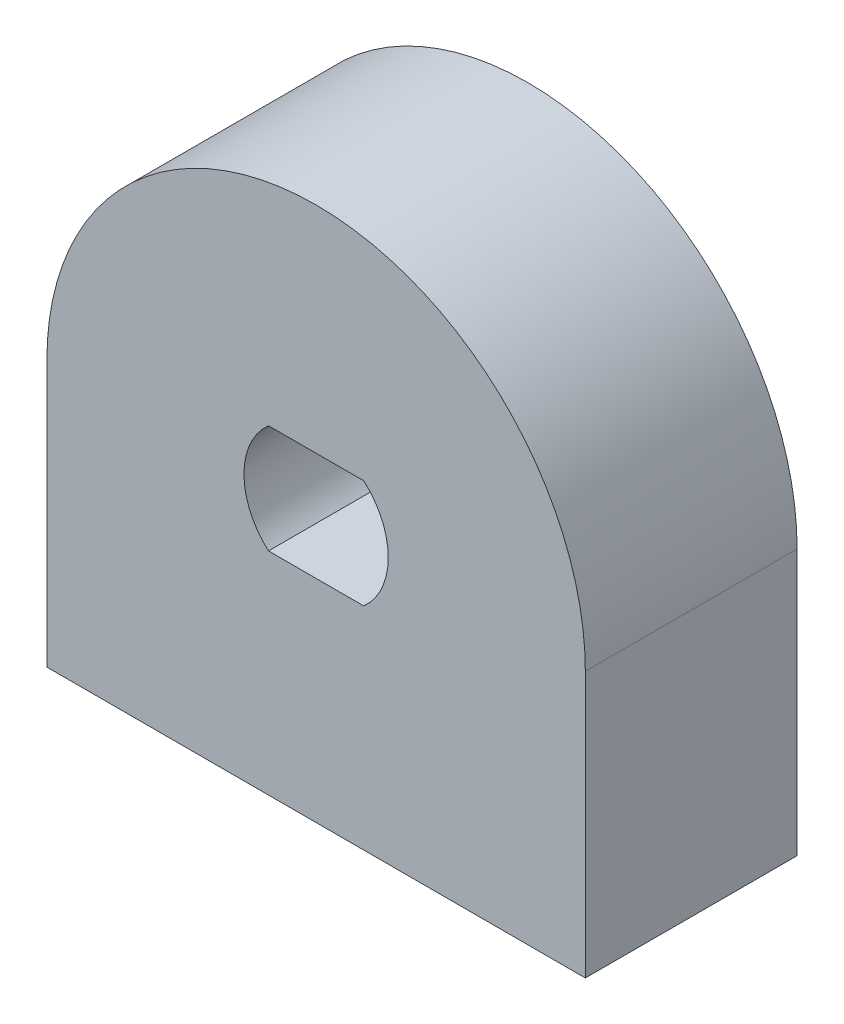
ISO-10303-21;
HEADER;
FILE_DESCRIPTION(('STEP AP214'),'2;1');
FILE_NAME('part.step','',(''),(''),'','','');
FILE_SCHEMA(('AUTOMOTIVE_DESIGN { 1 0 10303 214 1 1 1 1 }'));
ENDSEC;
DATA;
#1=APPLICATION_CONTEXT('core data for automotive mechanical design processes');
#2=APPLICATION_PROTOCOL_DEFINITION('international standard','automotive_design',2000,#1);
#3=PRODUCT_CONTEXT('',#1,'mechanical');
#4=PRODUCT('Part','Part','',(#3));
#5=PRODUCT_RELATED_PRODUCT_CATEGORY('part','',(#4));
#6=PRODUCT_DEFINITION_FORMATION('','',#4);
#7=PRODUCT_DEFINITION_CONTEXT('part definition',#1,'design');
#8=PRODUCT_DEFINITION('design','',#6,#7);
#9=PRODUCT_DEFINITION_SHAPE('','',#8);
#10=(LENGTH_UNIT() NAMED_UNIT(*) SI_UNIT(.MILLI.,.METRE.));
#11=(NAMED_UNIT(*) PLANE_ANGLE_UNIT() SI_UNIT($,.RADIAN.));
#12=(NAMED_UNIT(*) SI_UNIT($,.STERADIAN.) SOLID_ANGLE_UNIT());
#13=UNCERTAINTY_MEASURE_WITH_UNIT(LENGTH_MEASURE(1.E-05),#10,'distance_accuracy_value','');
#14=(GEOMETRIC_REPRESENTATION_CONTEXT(3) GLOBAL_UNCERTAINTY_ASSIGNED_CONTEXT((#13)) GLOBAL_UNIT_ASSIGNED_CONTEXT((#10,
#11,#12)) REPRESENTATION_CONTEXT('',''));
#15=CARTESIAN_POINT('',(0.,0.,0.));
#16=DIRECTION('',(0.,0.,1.));
#17=DIRECTION('',(1.,0.,0.));
#18=AXIS2_PLACEMENT_3D('',#15,#16,#17);
#19=CARTESIAN_POINT('',(7.5,7.4,5.9));
#20=DIRECTION('',(0.,0.,-1.));
#21=DIRECTION('',(-1.,0.,0.));
#22=AXIS2_PLACEMENT_3D('',#19,#20,#21);
#23=PLANE('',#22);
#24=DIRECTION('',(0.,-1.,0.));
#25=VECTOR('',#24,1.);
#26=CARTESIAN_POINT('',(0.,0.,5.9));
#27=LINE('',#26,#25);
#28=CARTESIAN_POINT('',(0.,7.4,5.9));
#29=VERTEX_POINT('',#28);
#30=CARTESIAN_POINT('',(0.,0.,5.9));
#31=VERTEX_POINT('',#30);
#32=EDGE_CURVE('E131',#29,#31,#27,.T.);
#33=ORIENTED_EDGE('',*,*,#32,.T.);
#34=DIRECTION('',(1.,0.,0.));
#35=VECTOR('',#34,1.);
#36=CARTESIAN_POINT('',(0.,0.,5.9));
#37=LINE('',#36,#35);
#38=CARTESIAN_POINT('',(15.,0.,5.9));
#39=VERTEX_POINT('',#38);
#40=EDGE_CURVE('E134',#31,#39,#37,.T.);
#41=ORIENTED_EDGE('',*,*,#40,.T.);
#42=DIRECTION('',(0.,1.,0.));
#43=VECTOR('',#42,1.);
#44=CARTESIAN_POINT('',(15.,0.,5.9));
#45=LINE('',#44,#43);
#46=CARTESIAN_POINT('',(15.,7.4,5.9));
#47=VERTEX_POINT('',#46);
#48=EDGE_CURVE('E137',#39,#47,#45,.T.);
#49=ORIENTED_EDGE('',*,*,#48,.T.);
#50=CARTESIAN_POINT('',(7.5,7.4,5.9));
#51=DIRECTION('',(0.,0.,1.));
#52=DIRECTION('',(-1.,0.,0.));
#53=AXIS2_PLACEMENT_3D('',#50,#51,#52);
#54=CIRCLE('',#53,7.5);
#55=EDGE_CURVE('E139',#47,#29,#54,.T.);
#56=ORIENTED_EDGE('',*,*,#55,.T.);
#57=EDGE_LOOP('',(#33,#41,#49,#56));
#58=FACE_BOUND('',#57,.T.);
#59=CARTESIAN_POINT('',(7.5,7.4,5.9));
#60=DIRECTION('',(0.,0.,1.));
#61=DIRECTION('',(1.,0.,0.));
#62=AXIS2_PLACEMENT_3D('',#59,#60,#61);
#63=CIRCLE('',#62,2.01);
#64=CARTESIAN_POINT('',(6.17335008385784,8.91,5.9));
#65=VERTEX_POINT('',#64);
#66=CARTESIAN_POINT('',(6.17335008385784,5.89,5.9));
#67=VERTEX_POINT('',#66);
#68=EDGE_CURVE('E95',#65,#67,#63,.T.);
#69=ORIENTED_EDGE('',*,*,#68,.F.);
#70=DIRECTION('',(-1.,0.,0.));
#71=VECTOR('',#70,1.);
#72=CARTESIAN_POINT('',(6.17335008385784,8.91,5.9));
#73=LINE('',#72,#71);
#74=CARTESIAN_POINT('',(8.82664991614216,8.91,5.9));
#75=VERTEX_POINT('',#74);
#76=EDGE_CURVE('E117',#75,#65,#73,.T.);
#77=ORIENTED_EDGE('',*,*,#76,.F.);
#78=CARTESIAN_POINT('',(7.5,7.4,5.9));
#79=DIRECTION('',(0.,0.,1.));
#80=DIRECTION('',(1.,0.,0.));
#81=AXIS2_PLACEMENT_3D('',#78,#79,#80);
#82=CIRCLE('',#81,2.01);
#83=CARTESIAN_POINT('',(8.82664991614216,5.89,5.9));
#84=VERTEX_POINT('',#83);
#85=EDGE_CURVE('E115',#84,#75,#82,.T.);
#86=ORIENTED_EDGE('',*,*,#85,.F.);
#87=DIRECTION('',(1.,0.,0.));
#88=VECTOR('',#87,1.);
#89=CARTESIAN_POINT('',(6.17335008385784,5.89,5.9));
#90=LINE('',#89,#88);
#91=EDGE_CURVE('E103',#67,#84,#90,.T.);
#92=ORIENTED_EDGE('',*,*,#91,.F.);
#93=EDGE_LOOP('',(#69,#77,#86,#92));
#94=FACE_BOUND('',#93,.T.);
#95=ADVANCED_FACE('F30',(#58,#94),#23,.F.);
#96=CARTESIAN_POINT('',(7.5,7.4,0.));
#97=DIRECTION('',(0.,0.,-1.));
#98=DIRECTION('',(-1.,0.,0.));
#99=AXIS2_PLACEMENT_3D('',#96,#97,#98);
#100=PLANE('',#99);
#101=DIRECTION('',(0.,-1.,0.));
#102=VECTOR('',#101,1.);
#103=CARTESIAN_POINT('',(0.,0.,0.));
#104=LINE('',#103,#102);
#105=CARTESIAN_POINT('',(0.,7.4,0.));
#106=VERTEX_POINT('',#105);
#107=CARTESIAN_POINT('',(0.,0.,0.));
#108=VERTEX_POINT('',#107);
#109=EDGE_CURVE('E111',#106,#108,#104,.T.);
#110=ORIENTED_EDGE('',*,*,#109,.F.);
#111=CARTESIAN_POINT('',(7.5,7.4,0.));
#112=DIRECTION('',(0.,0.,1.));
#113=DIRECTION('',(-1.,0.,0.));
#114=AXIS2_PLACEMENT_3D('',#111,#112,#113);
#115=CIRCLE('',#114,7.5);
#116=CARTESIAN_POINT('',(15.,7.4,0.));
#117=VERTEX_POINT('',#116);
#118=EDGE_CURVE('E135',#117,#106,#115,.T.);
#119=ORIENTED_EDGE('',*,*,#118,.F.);
#120=DIRECTION('',(0.,1.,0.));
#121=VECTOR('',#120,1.);
#122=CARTESIAN_POINT('',(15.,0.,0.));
#123=LINE('',#122,#121);
#124=CARTESIAN_POINT('',(15.,0.,0.));
#125=VERTEX_POINT('',#124);
#126=EDGE_CURVE('E146',#125,#117,#123,.T.);
#127=ORIENTED_EDGE('',*,*,#126,.F.);
#128=DIRECTION('',(1.,0.,0.));
#129=VECTOR('',#128,1.);
#130=CARTESIAN_POINT('',(0.,0.,0.));
#131=LINE('',#130,#129);
#132=EDGE_CURVE('E144',#108,#125,#131,.T.);
#133=ORIENTED_EDGE('',*,*,#132,.F.);
#134=EDGE_LOOP('',(#110,#119,#127,#133));
#135=FACE_BOUND('',#134,.T.);
#136=DIRECTION('',(-1.,0.,0.));
#137=VECTOR('',#136,1.);
#138=CARTESIAN_POINT('',(6.17335008385784,8.91,0.));
#139=LINE('',#138,#137);
#140=CARTESIAN_POINT('',(8.82664991614216,8.91,0.));
#141=VERTEX_POINT('',#140);
#142=CARTESIAN_POINT('',(6.17335008385784,8.91,0.));
#143=VERTEX_POINT('',#142);
#144=EDGE_CURVE('E104',#141,#143,#139,.T.);
#145=ORIENTED_EDGE('',*,*,#144,.T.);
#146=CARTESIAN_POINT('',(7.5,7.4,0.));
#147=DIRECTION('',(0.,0.,1.));
#148=DIRECTION('',(1.,0.,0.));
#149=AXIS2_PLACEMENT_3D('',#146,#147,#148);
#150=CIRCLE('',#149,2.01);
#151=CARTESIAN_POINT('',(6.17335008385784,5.89,0.));
#152=VERTEX_POINT('',#151);
#153=EDGE_CURVE('E53',#143,#152,#150,.T.);
#154=ORIENTED_EDGE('',*,*,#153,.T.);
#155=DIRECTION('',(1.,0.,0.));
#156=VECTOR('',#155,1.);
#157=CARTESIAN_POINT('',(6.17335008385784,5.89,0.));
#158=LINE('',#157,#156);
#159=CARTESIAN_POINT('',(8.82664991614216,5.89,0.));
#160=VERTEX_POINT('',#159);
#161=EDGE_CURVE('E110',#152,#160,#158,.T.);
#162=ORIENTED_EDGE('',*,*,#161,.T.);
#163=CARTESIAN_POINT('',(7.5,7.4,0.));
#164=DIRECTION('',(0.,0.,1.));
#165=DIRECTION('',(1.,0.,0.));
#166=AXIS2_PLACEMENT_3D('',#163,#164,#165);
#167=CIRCLE('',#166,2.01);
#168=EDGE_CURVE('E123',#160,#141,#167,.T.);
#169=ORIENTED_EDGE('',*,*,#168,.T.);
#170=EDGE_LOOP('',(#145,#154,#162,#169));
#171=FACE_BOUND('',#170,.T.);
#172=ADVANCED_FACE('F164',(#135,#171),#100,.T.);
#173=CARTESIAN_POINT('',(0.,0.,5.9));
#174=DIRECTION('',(1.,0.,0.));
#175=DIRECTION('',(0.,0.,-1.));
#176=AXIS2_PLACEMENT_3D('',#173,#174,#175);
#177=PLANE('',#176);
#178=ORIENTED_EDGE('',*,*,#109,.T.);
#179=DIRECTION('',(0.,0.,-1.));
#180=VECTOR('',#179,1.);
#181=CARTESIAN_POINT('',(0.,0.,5.9));
#182=LINE('',#181,#180);
#183=EDGE_CURVE('E11',#31,#108,#182,.T.);
#184=ORIENTED_EDGE('',*,*,#183,.F.);
#185=ORIENTED_EDGE('',*,*,#32,.F.);
#186=DIRECTION('',(0.,0.,-1.));
#187=VECTOR('',#186,1.);
#188=CARTESIAN_POINT('',(0.,7.4,5.9));
#189=LINE('',#188,#187);
#190=EDGE_CURVE('E141',#29,#106,#189,.T.);
#191=ORIENTED_EDGE('',*,*,#190,.T.);
#192=EDGE_LOOP('',(#178,#184,#185,#191));
#193=FACE_BOUND('',#192,.T.);
#194=ADVANCED_FACE('F32',(#193),#177,.F.);
#195=CARTESIAN_POINT('',(0.,0.,5.9));
#196=DIRECTION('',(0.,1.,0.));
#197=DIRECTION('',(-1.,0.,0.));
#198=AXIS2_PLACEMENT_3D('',#195,#196,#197);
#199=PLANE('',#198);
#200=ORIENTED_EDGE('',*,*,#132,.T.);
#201=DIRECTION('',(0.,0.,-1.));
#202=VECTOR('',#201,1.);
#203=CARTESIAN_POINT('',(15.,0.,5.9));
#204=LINE('',#203,#202);
#205=EDGE_CURVE('E38',#39,#125,#204,.T.);
#206=ORIENTED_EDGE('',*,*,#205,.F.);
#207=ORIENTED_EDGE('',*,*,#40,.F.);
#208=ORIENTED_EDGE('',*,*,#183,.T.);
#209=EDGE_LOOP('',(#200,#206,#207,#208));
#210=FACE_BOUND('',#209,.T.);
#211=ADVANCED_FACE('F174',(#210),#199,.F.);
#212=CARTESIAN_POINT('',(15.,0.,5.9));
#213=DIRECTION('',(-1.,0.,0.));
#214=DIRECTION('',(0.,0.,1.));
#215=AXIS2_PLACEMENT_3D('',#212,#213,#214);
#216=PLANE('',#215);
#217=ORIENTED_EDGE('',*,*,#126,.T.);
#218=DIRECTION('',(0.,0.,-1.));
#219=VECTOR('',#218,1.);
#220=CARTESIAN_POINT('',(15.,7.4,5.9));
#221=LINE('',#220,#219);
#222=EDGE_CURVE('E151',#47,#117,#221,.T.);
#223=ORIENTED_EDGE('',*,*,#222,.F.);
#224=ORIENTED_EDGE('',*,*,#48,.F.);
#225=ORIENTED_EDGE('',*,*,#205,.T.);
#226=EDGE_LOOP('',(#217,#223,#224,#225));
#227=FACE_BOUND('',#226,.T.);
#228=ADVANCED_FACE('F158',(#227),#216,.F.);
#229=CARTESIAN_POINT('',(7.5,7.4,5.9));
#230=DIRECTION('',(0.,0.,-1.));
#231=DIRECTION('',(-1.,0.,0.));
#232=AXIS2_PLACEMENT_3D('',#229,#230,#231);
#233=CYLINDRICAL_SURFACE('',#232,7.5);
#234=ORIENTED_EDGE('',*,*,#118,.T.);
#235=ORIENTED_EDGE('',*,*,#190,.F.);
#236=ORIENTED_EDGE('',*,*,#55,.F.);
#237=ORIENTED_EDGE('',*,*,#222,.T.);
#238=EDGE_LOOP('',(#234,#235,#236,#237));
#239=FACE_BOUND('',#238,.T.);
#240=ADVANCED_FACE('F168',(#239),#233,.T.);
#241=CARTESIAN_POINT('',(7.5,7.4,5.9));
#242=DIRECTION('',(0.,0.,-1.));
#243=DIRECTION('',(-1.,0.,0.));
#244=AXIS2_PLACEMENT_3D('',#241,#242,#243);
#245=CYLINDRICAL_SURFACE('',#244,2.01);
#246=ORIENTED_EDGE('',*,*,#153,.F.);
#247=DIRECTION('',(0.,0.,-1.));
#248=VECTOR('',#247,1.);
#249=CARTESIAN_POINT('',(6.17335008385784,8.91,5.9));
#250=LINE('',#249,#248);
#251=EDGE_CURVE('E99',#65,#143,#250,.T.);
#252=ORIENTED_EDGE('',*,*,#251,.F.);
#253=ORIENTED_EDGE('',*,*,#68,.T.);
#254=DIRECTION('',(0.,0.,-1.));
#255=VECTOR('',#254,1.);
#256=CARTESIAN_POINT('',(6.17335008385784,5.89,5.9));
#257=LINE('',#256,#255);
#258=EDGE_CURVE('E98',#67,#152,#257,.T.);
#259=ORIENTED_EDGE('',*,*,#258,.T.);
#260=EDGE_LOOP('',(#246,#252,#253,#259));
#261=FACE_BOUND('',#260,.T.);
#262=ADVANCED_FACE('F97',(#261),#245,.F.);
#263=CARTESIAN_POINT('',(6.17335008385784,5.89,5.9));
#264=DIRECTION('',(0.,1.,0.));
#265=DIRECTION('',(0.,0.,1.));
#266=AXIS2_PLACEMENT_3D('',#263,#264,#265);
#267=PLANE('',#266);
#268=ORIENTED_EDGE('',*,*,#161,.F.);
#269=ORIENTED_EDGE('',*,*,#258,.F.);
#270=ORIENTED_EDGE('',*,*,#91,.T.);
#271=DIRECTION('',(0.,0.,-1.));
#272=VECTOR('',#271,1.);
#273=CARTESIAN_POINT('',(8.82664991614216,5.89,5.9));
#274=LINE('',#273,#272);
#275=EDGE_CURVE('E112',#84,#160,#274,.T.);
#276=ORIENTED_EDGE('',*,*,#275,.T.);
#277=EDGE_LOOP('',(#268,#269,#270,#276));
#278=FACE_BOUND('',#277,.T.);
#279=ADVANCED_FACE('F107',(#278),#267,.T.);
#280=CARTESIAN_POINT('',(7.5,7.4,5.9));
#281=DIRECTION('',(0.,0.,-1.));
#282=DIRECTION('',(-1.,0.,0.));
#283=AXIS2_PLACEMENT_3D('',#280,#281,#282);
#284=CYLINDRICAL_SURFACE('',#283,2.01);
#285=ORIENTED_EDGE('',*,*,#168,.F.);
#286=ORIENTED_EDGE('',*,*,#275,.F.);
#287=ORIENTED_EDGE('',*,*,#85,.T.);
#288=DIRECTION('',(0.,0.,-1.));
#289=VECTOR('',#288,1.);
#290=CARTESIAN_POINT('',(8.82664991614216,8.91,5.9));
#291=LINE('',#290,#289);
#292=EDGE_CURVE('E45',#75,#141,#291,.T.);
#293=ORIENTED_EDGE('',*,*,#292,.T.);
#294=EDGE_LOOP('',(#285,#286,#287,#293));
#295=FACE_BOUND('',#294,.T.);
#296=ADVANCED_FACE('F197',(#295),#284,.F.);
#297=CARTESIAN_POINT('',(6.17335008385784,8.91,5.9));
#298=DIRECTION('',(0.,-1.,0.));
#299=DIRECTION('',(0.,0.,-1.));
#300=AXIS2_PLACEMENT_3D('',#297,#298,#299);
#301=PLANE('',#300);
#302=ORIENTED_EDGE('',*,*,#144,.F.);
#303=ORIENTED_EDGE('',*,*,#292,.F.);
#304=ORIENTED_EDGE('',*,*,#76,.T.);
#305=ORIENTED_EDGE('',*,*,#251,.T.);
#306=EDGE_LOOP('',(#302,#303,#304,#305));
#307=FACE_BOUND('',#306,.T.);
#308=ADVANCED_FACE('F201',(#307),#301,.T.);
#309=CLOSED_SHELL('',(#95,#172,#194,#211,#228,#240,#262,#279,#296,#308));
#310=MANIFOLD_SOLID_BREP('B2',#309);
#311=ADVANCED_BREP_SHAPE_REPRESENTATION('',(#18,#310),#14);
#312=SHAPE_DEFINITION_REPRESENTATION(#9,#311);
ENDSEC;
END-ISO-10303-21;
